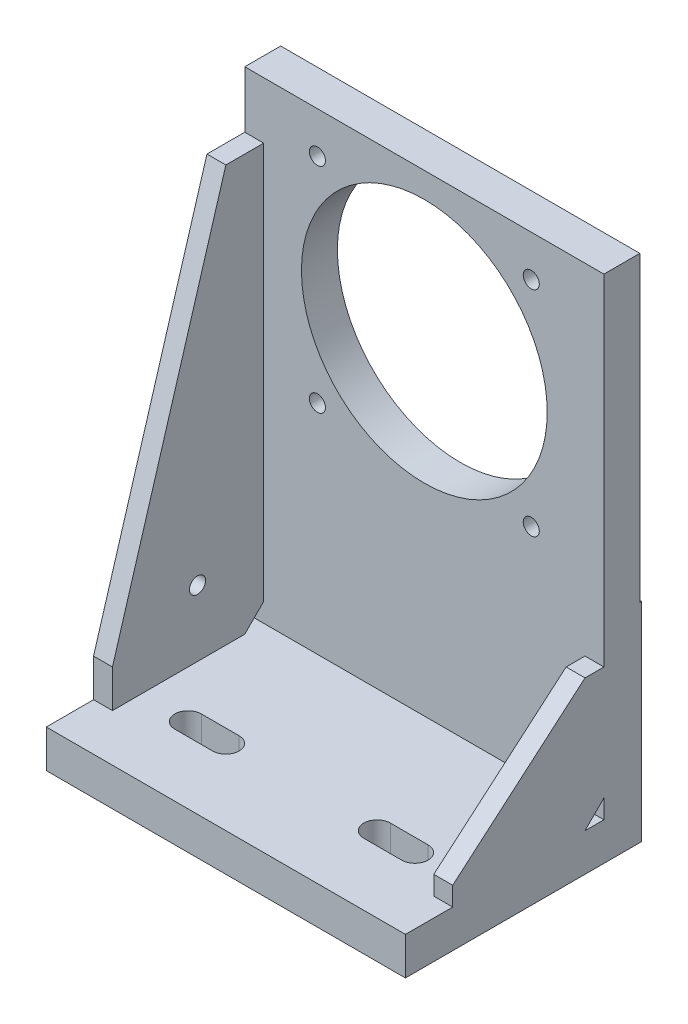
ISO-10303-21;
HEADER;
FILE_DESCRIPTION(('STEP AP214'),'2;1');
FILE_NAME('part.step','',(''),(''),'','','');
FILE_SCHEMA(('AUTOMOTIVE_DESIGN { 1 0 10303 214 1 1 1 1 }'));
ENDSEC;
DATA;
#1=APPLICATION_CONTEXT('core data for automotive mechanical design processes');
#2=APPLICATION_PROTOCOL_DEFINITION('international standard','automotive_design',2000,#1);
#3=PRODUCT_CONTEXT('',#1,'mechanical');
#4=PRODUCT('Part','Part','',(#3));
#5=PRODUCT_RELATED_PRODUCT_CATEGORY('part','',(#4));
#6=PRODUCT_DEFINITION_FORMATION('','',#4);
#7=PRODUCT_DEFINITION_CONTEXT('part definition',#1,'design');
#8=PRODUCT_DEFINITION('design','',#6,#7);
#9=PRODUCT_DEFINITION_SHAPE('','',#8);
#10=(LENGTH_UNIT() NAMED_UNIT(*) SI_UNIT(.MILLI.,.METRE.));
#11=(NAMED_UNIT(*) PLANE_ANGLE_UNIT() SI_UNIT($,.RADIAN.));
#12=(NAMED_UNIT(*) SI_UNIT($,.STERADIAN.) SOLID_ANGLE_UNIT());
#13=UNCERTAINTY_MEASURE_WITH_UNIT(LENGTH_MEASURE(1.E-05),#10,'distance_accuracy_value','');
#14=(GEOMETRIC_REPRESENTATION_CONTEXT(3) GLOBAL_UNCERTAINTY_ASSIGNED_CONTEXT((#13)) GLOBAL_UNIT_ASSIGNED_CONTEXT((#10,
#11,#12)) REPRESENTATION_CONTEXT('',''));
#15=CARTESIAN_POINT('',(0.,0.,0.));
#16=DIRECTION('',(0.,0.,1.));
#17=DIRECTION('',(1.,0.,0.));
#18=AXIS2_PLACEMENT_3D('',#15,#16,#17);
#19=CARTESIAN_POINT('',(0.,20.,0.));
#20=DIRECTION('',(1.,0.,0.));
#21=DIRECTION('',(0.,0.,-1.));
#22=AXIS2_PLACEMENT_3D('',#19,#20,#21);
#23=PLANE('',#22);
#24=DIRECTION('',(0.,1.,0.));
#25=VECTOR('',#24,1.);
#26=CARTESIAN_POINT('',(0.,270.,1.));
#27=LINE('',#26,#25);
#28=CARTESIAN_POINT('',(0.,110.,1.));
#29=VERTEX_POINT('',#28);
#30=CARTESIAN_POINT('',(0.,270.,1.));
#31=VERTEX_POINT('',#30);
#32=EDGE_CURVE('E302',#29,#31,#27,.T.);
#33=ORIENTED_EDGE('',*,*,#32,.F.);
#34=DIRECTION('',(0.,0.,-1.));
#35=VECTOR('',#34,1.);
#36=CARTESIAN_POINT('',(0.,110.,1.));
#37=LINE('',#36,#35);
#38=CARTESIAN_POINT('',(0.,110.,0.));
#39=VERTEX_POINT('',#38);
#40=EDGE_CURVE('E308',#29,#39,#37,.T.);
#41=ORIENTED_EDGE('',*,*,#40,.T.);
#42=DIRECTION('',(0.,-1.,0.));
#43=VECTOR('',#42,1.);
#44=CARTESIAN_POINT('',(0.,20.,0.));
#45=LINE('',#44,#43);
#46=CARTESIAN_POINT('',(0.,0.,0.));
#47=VERTEX_POINT('',#46);
#48=EDGE_CURVE('E428',#39,#47,#45,.T.);
#49=ORIENTED_EDGE('',*,*,#48,.T.);
#50=DIRECTION('',(0.,0.,1.));
#51=VECTOR('',#50,1.);
#52=CARTESIAN_POINT('',(0.,0.,0.));
#53=LINE('',#52,#51);
#54=CARTESIAN_POINT('',(0.,0.,125.));
#55=VERTEX_POINT('',#54);
#56=EDGE_CURVE('E423',#47,#55,#53,.T.);
#57=ORIENTED_EDGE('',*,*,#56,.T.);
#58=DIRECTION('',(0.,-1.,0.));
#59=VECTOR('',#58,1.);
#60=CARTESIAN_POINT('',(0.,20.,125.));
#61=LINE('',#60,#59);
#62=CARTESIAN_POINT('',(0.,20.,125.));
#63=VERTEX_POINT('',#62);
#64=EDGE_CURVE('E41',#63,#55,#61,.T.);
#65=ORIENTED_EDGE('',*,*,#64,.F.);
#66=DIRECTION('',(0.,0.,1.));
#67=VECTOR('',#66,1.);
#68=CARTESIAN_POINT('',(0.,20.,0.));
#69=LINE('',#68,#67);
#70=CARTESIAN_POINT('',(0.,20.,100.));
#71=VERTEX_POINT('',#70);
#72=EDGE_CURVE('E410',#71,#63,#69,.T.);
#73=ORIENTED_EDGE('',*,*,#72,.F.);
#74=DIRECTION('',(0.,1.,0.));
#75=VECTOR('',#74,1.);
#76=CARTESIAN_POINT('',(0.,20.,100.));
#77=LINE('',#76,#75);
#78=CARTESIAN_POINT('',(0.,40.,100.));
#79=VERTEX_POINT('',#78);
#80=EDGE_CURVE('E375',#71,#79,#77,.T.);
#81=ORIENTED_EDGE('',*,*,#80,.T.);
#82=DIRECTION('',(0.,-0.957826285221151,0.287347885566345));
#83=VECTOR('',#82,1.);
#84=CARTESIAN_POINT('',(0.,240.,40.));
#85=LINE('',#84,#83);
#86=CARTESIAN_POINT('',(0.,240.,40.));
#87=VERTEX_POINT('',#86);
#88=EDGE_CURVE('E321',#87,#79,#85,.T.);
#89=ORIENTED_EDGE('',*,*,#88,.F.);
#90=DIRECTION('',(0.,0.,-1.));
#91=VECTOR('',#90,1.);
#92=CARTESIAN_POINT('',(0.,240.,20.));
#93=LINE('',#92,#91);
#94=CARTESIAN_POINT('',(0.,240.,20.));
#95=VERTEX_POINT('',#94);
#96=EDGE_CURVE('E382',#87,#95,#93,.T.);
#97=ORIENTED_EDGE('',*,*,#96,.T.);
#98=DIRECTION('',(0.,1.,0.));
#99=VECTOR('',#98,1.);
#100=CARTESIAN_POINT('',(0.,20.,20.));
#101=LINE('',#100,#99);
#102=CARTESIAN_POINT('',(0.,270.,20.));
#103=VERTEX_POINT('',#102);
#104=EDGE_CURVE('E396',#95,#103,#101,.T.);
#105=ORIENTED_EDGE('',*,*,#104,.T.);
#106=DIRECTION('',(0.,0.,-1.));
#107=VECTOR('',#106,1.);
#108=CARTESIAN_POINT('',(0.,270.,20.));
#109=LINE('',#108,#107);
#110=EDGE_CURVE('E409',#103,#31,#109,.T.);
#111=ORIENTED_EDGE('',*,*,#110,.T.);
#112=EDGE_LOOP('',(#33,#41,#49,#57,#65,#73,#81,#89,#97,#105,#111));
#113=FACE_BOUND('',#112,.T.);
#114=DIRECTION('',(0.,-1.,0.));
#115=VECTOR('',#114,1.);
#116=CARTESIAN_POINT('',(0.,30.,20.));
#117=LINE('',#116,#115);
#118=CARTESIAN_POINT('',(0.,30.,20.));
#119=VERTEX_POINT('',#118);
#120=CARTESIAN_POINT('',(0.,20.,20.));
#121=VERTEX_POINT('',#120);
#122=EDGE_CURVE('E344',#119,#121,#117,.T.);
#123=ORIENTED_EDGE('',*,*,#122,.F.);
#124=DIRECTION('',(0.,0.707106781186548,-0.707106781186548));
#125=VECTOR('',#124,1.);
#126=CARTESIAN_POINT('',(0.,20.,30.));
#127=LINE('',#126,#125);
#128=CARTESIAN_POINT('',(0.,20.,30.));
#129=VERTEX_POINT('',#128);
#130=EDGE_CURVE('E331',#129,#119,#127,.T.);
#131=ORIENTED_EDGE('',*,*,#130,.F.);
#132=DIRECTION('',(0.,0.,1.));
#133=VECTOR('',#132,1.);
#134=CARTESIAN_POINT('',(0.,20.,20.));
#135=LINE('',#134,#133);
#136=EDGE_CURVE('E336',#121,#129,#135,.T.);
#137=ORIENTED_EDGE('',*,*,#136,.F.);
#138=EDGE_LOOP('',(#123,#131,#137));
#139=FACE_BOUND('',#138,.T.);
#140=CARTESIAN_POINT('',(0.,55.,55.));
#141=DIRECTION('',(-1.,0.,0.));
#142=DIRECTION('',(0.,0.,1.));
#143=AXIS2_PLACEMENT_3D('',#140,#141,#142);
#144=CIRCLE('',#143,4.24999999999999);
#145=CARTESIAN_POINT('',(0.,55.,59.25));
#146=VERTEX_POINT('',#145);
#147=EDGE_CURVE('E902',#146,#146,#144,.T.);
#148=ORIENTED_EDGE('',*,*,#147,.F.);
#149=EDGE_LOOP('',(#148));
#150=FACE_BOUND('',#149,.T.);
#151=ADVANCED_FACE('F34',(#113,#139,#150),#23,.F.);
#152=CARTESIAN_POINT('',(0.,270.,20.));
#153=DIRECTION('',(0.,1.,0.));
#154=DIRECTION('',(-1.,0.,0.));
#155=AXIS2_PLACEMENT_3D('',#152,#153,#154);
#156=PLANE('',#155);
#157=DIRECTION('',(0.,0.,-1.));
#158=VECTOR('',#157,1.);
#159=CARTESIAN_POINT('',(190.,270.,20.));
#160=LINE('',#159,#158);
#161=CARTESIAN_POINT('',(190.,270.,20.));
#162=VERTEX_POINT('',#161);
#163=CARTESIAN_POINT('',(190.,270.,1.));
#164=VERTEX_POINT('',#163);
#165=EDGE_CURVE('E405',#162,#164,#160,.T.);
#166=ORIENTED_EDGE('',*,*,#165,.T.);
#167=DIRECTION('',(1.,0.,0.));
#168=VECTOR('',#167,1.);
#169=CARTESIAN_POINT('',(190.,270.,1.));
#170=LINE('',#169,#168);
#171=EDGE_CURVE('E304',#31,#164,#170,.T.);
#172=ORIENTED_EDGE('',*,*,#171,.F.);
#173=ORIENTED_EDGE('',*,*,#110,.F.);
#174=DIRECTION('',(1.,0.,0.));
#175=VECTOR('',#174,1.);
#176=CARTESIAN_POINT('',(0.,270.,20.));
#177=LINE('',#176,#175);
#178=EDGE_CURVE('E399',#103,#162,#177,.T.);
#179=ORIENTED_EDGE('',*,*,#178,.T.);
#180=EDGE_LOOP('',(#166,#172,#173,#179));
#181=FACE_BOUND('',#180,.T.);
#182=ADVANCED_FACE('F448',(#181),#156,.T.);
#183=CARTESIAN_POINT('',(0.,20.,125.));
#184=DIRECTION('',(0.,1.,0.));
#185=DIRECTION('',(0.,0.,1.));
#186=AXIS2_PLACEMENT_3D('',#183,#184,#185);
#187=PLANE('',#186);
#188=CARTESIAN_POINT('',(135.,20.,85.));
#189=DIRECTION('',(0.,1.,0.));
#190=DIRECTION('',(0.,0.,1.));
#191=AXIS2_PLACEMENT_3D('',#188,#189,#190);
#192=CIRCLE('',#191,6.99999999999999);
#193=CARTESIAN_POINT('',(135.,20.,78.));
#194=VERTEX_POINT('',#193);
#195=CARTESIAN_POINT('',(135.,20.,92.));
#196=VERTEX_POINT('',#195);
#197=EDGE_CURVE('E48',#194,#196,#192,.T.);
#198=ORIENTED_EDGE('',*,*,#197,.F.);
#199=DIRECTION('',(-1.,0.,0.));
#200=VECTOR('',#199,1.);
#201=CARTESIAN_POINT('',(135.,20.,78.));
#202=LINE('',#201,#200);
#203=CARTESIAN_POINT('',(155.,20.,78.));
#204=VERTEX_POINT('',#203);
#205=EDGE_CURVE('E236',#204,#194,#202,.T.);
#206=ORIENTED_EDGE('',*,*,#205,.F.);
#207=CARTESIAN_POINT('',(155.,20.,85.));
#208=DIRECTION('',(0.,1.,0.));
#209=DIRECTION('',(0.,0.,1.));
#210=AXIS2_PLACEMENT_3D('',#207,#208,#209);
#211=CIRCLE('',#210,6.99999999999999);
#212=CARTESIAN_POINT('',(155.,20.,92.));
#213=VERTEX_POINT('',#212);
#214=EDGE_CURVE('E239',#213,#204,#211,.T.);
#215=ORIENTED_EDGE('',*,*,#214,.F.);
#216=DIRECTION('',(1.,0.,0.));
#217=VECTOR('',#216,1.);
#218=CARTESIAN_POINT('',(135.,20.,92.));
#219=LINE('',#218,#217);
#220=EDGE_CURVE('E248',#196,#213,#219,.T.);
#221=ORIENTED_EDGE('',*,*,#220,.F.);
#222=EDGE_LOOP('',(#198,#206,#215,#221));
#223=FACE_BOUND('',#222,.T.);
#224=CARTESIAN_POINT('',(35.,20.,85.));
#225=DIRECTION('',(0.,1.,0.));
#226=DIRECTION('',(0.,0.,1.));
#227=AXIS2_PLACEMENT_3D('',#224,#225,#226);
#228=CIRCLE('',#227,7.00000000000001);
#229=CARTESIAN_POINT('',(35.,20.,78.));
#230=VERTEX_POINT('',#229);
#231=CARTESIAN_POINT('',(35.,20.,92.));
#232=VERTEX_POINT('',#231);
#233=EDGE_CURVE('E254',#230,#232,#228,.T.);
#234=ORIENTED_EDGE('',*,*,#233,.F.);
#235=DIRECTION('',(-1.,0.,0.));
#236=VECTOR('',#235,1.);
#237=CARTESIAN_POINT('',(35.,20.,78.));
#238=LINE('',#237,#236);
#239=CARTESIAN_POINT('',(55.,20.,78.));
#240=VERTEX_POINT('',#239);
#241=EDGE_CURVE('E262',#240,#230,#238,.T.);
#242=ORIENTED_EDGE('',*,*,#241,.F.);
#243=CARTESIAN_POINT('',(55.,20.,85.));
#244=DIRECTION('',(0.,1.,0.));
#245=DIRECTION('',(0.,0.,1.));
#246=AXIS2_PLACEMENT_3D('',#243,#244,#245);
#247=CIRCLE('',#246,7.00000000000001);
#248=CARTESIAN_POINT('',(55.,20.,92.));
#249=VERTEX_POINT('',#248);
#250=EDGE_CURVE('E276',#249,#240,#247,.T.);
#251=ORIENTED_EDGE('',*,*,#250,.F.);
#252=DIRECTION('',(1.,0.,0.));
#253=VECTOR('',#252,1.);
#254=CARTESIAN_POINT('',(35.,20.,92.));
#255=LINE('',#254,#253);
#256=EDGE_CURVE('E273',#232,#249,#255,.T.);
#257=ORIENTED_EDGE('',*,*,#256,.F.);
#258=EDGE_LOOP('',(#234,#242,#251,#257));
#259=FACE_BOUND('',#258,.T.);
#260=DIRECTION('',(0.,0.,-1.));
#261=VECTOR('',#260,1.);
#262=CARTESIAN_POINT('',(180.,20.,20.));
#263=LINE('',#262,#261);
#264=CARTESIAN_POINT('',(180.,20.,100.));
#265=VERTEX_POINT('',#264);
#266=CARTESIAN_POINT('',(180.,20.,30.));
#267=VERTEX_POINT('',#266);
#268=EDGE_CURVE('E365',#265,#267,#263,.T.);
#269=ORIENTED_EDGE('',*,*,#268,.T.);
#270=DIRECTION('',(-1.,0.,0.));
#271=VECTOR('',#270,1.);
#272=CARTESIAN_POINT('',(190.,20.,30.));
#273=LINE('',#272,#271);
#274=CARTESIAN_POINT('',(190.,20.,30.));
#275=VERTEX_POINT('',#274);
#276=EDGE_CURVE('E349',#275,#267,#273,.T.);
#277=ORIENTED_EDGE('',*,*,#276,.F.);
#278=DIRECTION('',(0.,0.,1.));
#279=VECTOR('',#278,1.);
#280=CARTESIAN_POINT('',(190.,20.,20.));
#281=LINE('',#280,#279);
#282=CARTESIAN_POINT('',(190.,20.,20.));
#283=VERTEX_POINT('',#282);
#284=EDGE_CURVE('E339',#283,#275,#281,.T.);
#285=ORIENTED_EDGE('',*,*,#284,.F.);
#286=DIRECTION('',(-1.,0.,0.));
#287=VECTOR('',#286,1.);
#288=CARTESIAN_POINT('',(0.,20.,20.));
#289=LINE('',#288,#287);
#290=EDGE_CURVE('E407',#283,#121,#289,.T.);
#291=ORIENTED_EDGE('',*,*,#290,.T.);
#292=ORIENTED_EDGE('',*,*,#136,.T.);
#293=CARTESIAN_POINT('',(10.,20.,30.));
#294=VERTEX_POINT('',#293);
#295=EDGE_CURVE('E352',#294,#129,#273,.T.);
#296=ORIENTED_EDGE('',*,*,#295,.F.);
#297=DIRECTION('',(0.,0.,1.));
#298=VECTOR('',#297,1.);
#299=CARTESIAN_POINT('',(10.,20.,20.));
#300=LINE('',#299,#298);
#301=CARTESIAN_POINT('',(10.,20.,100.));
#302=VERTEX_POINT('',#301);
#303=EDGE_CURVE('E381',#294,#302,#300,.T.);
#304=ORIENTED_EDGE('',*,*,#303,.T.);
#305=DIRECTION('',(-1.,0.,0.));
#306=VECTOR('',#305,1.);
#307=CARTESIAN_POINT('',(10.,20.,100.));
#308=LINE('',#307,#306);
#309=EDGE_CURVE('E389',#302,#71,#308,.T.);
#310=ORIENTED_EDGE('',*,*,#309,.T.);
#311=ORIENTED_EDGE('',*,*,#72,.T.);
#312=DIRECTION('',(1.,0.,0.));
#313=VECTOR('',#312,1.);
#314=CARTESIAN_POINT('',(0.,20.,125.));
#315=LINE('',#314,#313);
#316=CARTESIAN_POINT('',(190.,20.,125.));
#317=VERTEX_POINT('',#316);
#318=EDGE_CURVE('E413',#63,#317,#315,.T.);
#319=ORIENTED_EDGE('',*,*,#318,.T.);
#320=DIRECTION('',(0.,0.,-1.));
#321=VECTOR('',#320,1.);
#322=CARTESIAN_POINT('',(190.,20.,0.));
#323=LINE('',#322,#321);
#324=CARTESIAN_POINT('',(190.,20.,100.));
#325=VERTEX_POINT('',#324);
#326=EDGE_CURVE('E420',#317,#325,#323,.T.);
#327=ORIENTED_EDGE('',*,*,#326,.T.);
#328=DIRECTION('',(1.,0.,0.));
#329=VECTOR('',#328,1.);
#330=CARTESIAN_POINT('',(180.,20.,100.));
#331=LINE('',#330,#329);
#332=EDGE_CURVE('E372',#265,#325,#331,.T.);
#333=ORIENTED_EDGE('',*,*,#332,.F.);
#334=EDGE_LOOP('',(#269,#277,#285,#291,#292,#296,#304,#310,#311,#319,#327,#333));
#335=FACE_BOUND('',#334,.T.);
#336=ADVANCED_FACE('F478',(#223,#259,#335),#187,.T.);
#337=CARTESIAN_POINT('',(0.,20.,125.));
#338=DIRECTION('',(0.,0.,-1.));
#339=DIRECTION('',(-1.,0.,0.));
#340=AXIS2_PLACEMENT_3D('',#337,#338,#339);
#341=PLANE('',#340);
#342=DIRECTION('',(1.,0.,0.));
#343=VECTOR('',#342,1.);
#344=CARTESIAN_POINT('',(0.,0.,125.));
#345=LINE('',#344,#343);
#346=CARTESIAN_POINT('',(190.,0.,125.));
#347=VERTEX_POINT('',#346);
#348=EDGE_CURVE('E454',#55,#347,#345,.T.);
#349=ORIENTED_EDGE('',*,*,#348,.T.);
#350=DIRECTION('',(0.,-1.,0.));
#351=VECTOR('',#350,1.);
#352=CARTESIAN_POINT('',(190.,20.,125.));
#353=LINE('',#352,#351);
#354=EDGE_CURVE('E469',#317,#347,#353,.T.);
#355=ORIENTED_EDGE('',*,*,#354,.F.);
#356=ORIENTED_EDGE('',*,*,#318,.F.);
#357=ORIENTED_EDGE('',*,*,#64,.T.);
#358=EDGE_LOOP('',(#349,#355,#356,#357));
#359=FACE_BOUND('',#358,.T.);
#360=ADVANCED_FACE('F473',(#359),#341,.F.);
#361=CARTESIAN_POINT('',(190.,20.,0.));
#362=DIRECTION('',(-1.,0.,0.));
#363=DIRECTION('',(0.,0.,1.));
#364=AXIS2_PLACEMENT_3D('',#361,#362,#363);
#365=PLANE('',#364);
#366=ORIENTED_EDGE('',*,*,#284,.T.);
#367=DIRECTION('',(0.,0.707106781186548,-0.707106781186548));
#368=VECTOR('',#367,1.);
#369=CARTESIAN_POINT('',(190.,20.,30.));
#370=LINE('',#369,#368);
#371=CARTESIAN_POINT('',(190.,30.,20.));
#372=VERTEX_POINT('',#371);
#373=EDGE_CURVE('E332',#275,#372,#370,.T.);
#374=ORIENTED_EDGE('',*,*,#373,.T.);
#375=DIRECTION('',(0.,-1.,0.));
#376=VECTOR('',#375,1.);
#377=CARTESIAN_POINT('',(190.,30.,20.));
#378=LINE('',#377,#376);
#379=EDGE_CURVE('E335',#372,#283,#378,.T.);
#380=ORIENTED_EDGE('',*,*,#379,.T.);
#381=EDGE_LOOP('',(#366,#374,#380));
#382=FACE_BOUND('',#381,.T.);
#383=DIRECTION('',(0.,-1.,0.));
#384=VECTOR('',#383,1.);
#385=CARTESIAN_POINT('',(190.,20.,0.));
#386=LINE('',#385,#384);
#387=CARTESIAN_POINT('',(190.,110.,0.));
#388=VERTEX_POINT('',#387);
#389=CARTESIAN_POINT('',(190.,0.,0.));
#390=VERTEX_POINT('',#389);
#391=EDGE_CURVE('E468',#388,#390,#386,.T.);
#392=ORIENTED_EDGE('',*,*,#391,.F.);
#393=DIRECTION('',(0.,0.,-1.));
#394=VECTOR('',#393,1.);
#395=CARTESIAN_POINT('',(190.,110.,1.));
#396=LINE('',#395,#394);
#397=CARTESIAN_POINT('',(190.,110.,1.));
#398=VERTEX_POINT('',#397);
#399=EDGE_CURVE('E306',#398,#388,#396,.T.);
#400=ORIENTED_EDGE('',*,*,#399,.F.);
#401=DIRECTION('',(0.,-1.,0.));
#402=VECTOR('',#401,1.);
#403=CARTESIAN_POINT('',(190.,270.,1.));
#404=LINE('',#403,#402);
#405=EDGE_CURVE('E296',#164,#398,#404,.T.);
#406=ORIENTED_EDGE('',*,*,#405,.F.);
#407=ORIENTED_EDGE('',*,*,#165,.F.);
#408=DIRECTION('',(0.,-1.,0.));
#409=VECTOR('',#408,1.);
#410=CARTESIAN_POINT('',(190.,20.,20.));
#411=LINE('',#410,#409);
#412=CARTESIAN_POINT('',(190.,90.,20.));
#413=VERTEX_POINT('',#412);
#414=EDGE_CURVE('E402',#162,#413,#411,.T.);
#415=ORIENTED_EDGE('',*,*,#414,.T.);
#416=DIRECTION('',(0.,0.,1.));
#417=VECTOR('',#416,1.);
#418=CARTESIAN_POINT('',(190.,90.,20.));
#419=LINE('',#418,#417);
#420=CARTESIAN_POINT('',(190.,90.,30.));
#421=VERTEX_POINT('',#420);
#422=EDGE_CURVE('E356',#413,#421,#419,.T.);
#423=ORIENTED_EDGE('',*,*,#422,.T.);
#424=DIRECTION('',(0.,0.650791373455969,-0.759256602365297));
#425=VECTOR('',#424,1.);
#426=CARTESIAN_POINT('',(190.,90.,30.));
#427=LINE('',#426,#425);
#428=CARTESIAN_POINT('',(190.,30.,100.));
#429=VERTEX_POINT('',#428);
#430=EDGE_CURVE('E311',#429,#421,#427,.T.);
#431=ORIENTED_EDGE('',*,*,#430,.F.);
#432=DIRECTION('',(0.,-1.,0.));
#433=VECTOR('',#432,1.);
#434=CARTESIAN_POINT('',(190.,20.,100.));
#435=LINE('',#434,#433);
#436=EDGE_CURVE('E360',#429,#325,#435,.T.);
#437=ORIENTED_EDGE('',*,*,#436,.T.);
#438=ORIENTED_EDGE('',*,*,#326,.F.);
#439=ORIENTED_EDGE('',*,*,#354,.T.);
#440=DIRECTION('',(0.,0.,-1.));
#441=VECTOR('',#440,1.);
#442=CARTESIAN_POINT('',(190.,0.,0.));
#443=LINE('',#442,#441);
#444=EDGE_CURVE('E457',#347,#390,#443,.T.);
#445=ORIENTED_EDGE('',*,*,#444,.T.);
#446=EDGE_LOOP('',(#392,#400,#406,#407,#415,#423,#431,#437,#438,#439,#445));
#447=FACE_BOUND('',#446,.T.);
#448=ADVANCED_FACE('F437',(#382,#447),#365,.F.);
#449=CARTESIAN_POINT('',(0.,20.,0.));
#450=DIRECTION('',(0.,0.,1.));
#451=DIRECTION('',(1.,0.,0.));
#452=AXIS2_PLACEMENT_3D('',#449,#450,#451);
#453=PLANE('',#452);
#454=ORIENTED_EDGE('',*,*,#48,.F.);
#455=DIRECTION('',(-1.,0.,0.));
#456=VECTOR('',#455,1.);
#457=CARTESIAN_POINT('',(190.,110.,0.));
#458=LINE('',#457,#456);
#459=EDGE_CURVE('E295',#388,#39,#458,.T.);
#460=ORIENTED_EDGE('',*,*,#459,.F.);
#461=ORIENTED_EDGE('',*,*,#391,.T.);
#462=DIRECTION('',(-1.,0.,0.));
#463=VECTOR('',#462,1.);
#464=CARTESIAN_POINT('',(0.,0.,0.));
#465=LINE('',#464,#463);
#466=EDGE_CURVE('E414',#390,#47,#465,.T.);
#467=ORIENTED_EDGE('',*,*,#466,.T.);
#468=EDGE_LOOP('',(#454,#460,#461,#467));
#469=FACE_BOUND('',#468,.T.);
#470=ADVANCED_FACE('F552',(#469),#453,.F.);
#471=CARTESIAN_POINT('',(0.,0.,125.));
#472=DIRECTION('',(0.,1.,0.));
#473=DIRECTION('',(0.,0.,1.));
#474=AXIS2_PLACEMENT_3D('',#471,#472,#473);
#475=PLANE('',#474);
#476=DIRECTION('',(-1.,0.,0.));
#477=VECTOR('',#476,1.);
#478=CARTESIAN_POINT('',(135.,0.,78.));
#479=LINE('',#478,#477);
#480=CARTESIAN_POINT('',(155.,0.,78.));
#481=VERTEX_POINT('',#480);
#482=CARTESIAN_POINT('',(135.,0.,78.));
#483=VERTEX_POINT('',#482);
#484=EDGE_CURVE('E226',#481,#483,#479,.T.);
#485=ORIENTED_EDGE('',*,*,#484,.T.);
#486=CARTESIAN_POINT('',(135.,0.,85.));
#487=DIRECTION('',(0.,1.,0.));
#488=DIRECTION('',(0.,0.,1.));
#489=AXIS2_PLACEMENT_3D('',#486,#487,#488);
#490=CIRCLE('',#489,6.99999999999999);
#491=CARTESIAN_POINT('',(135.,0.,92.));
#492=VERTEX_POINT('',#491);
#493=EDGE_CURVE('E220',#483,#492,#490,.T.);
#494=ORIENTED_EDGE('',*,*,#493,.T.);
#495=DIRECTION('',(1.,0.,0.));
#496=VECTOR('',#495,1.);
#497=CARTESIAN_POINT('',(135.,0.,92.));
#498=LINE('',#497,#496);
#499=CARTESIAN_POINT('',(155.,0.,92.));
#500=VERTEX_POINT('',#499);
#501=EDGE_CURVE('E229',#492,#500,#498,.T.);
#502=ORIENTED_EDGE('',*,*,#501,.T.);
#503=CARTESIAN_POINT('',(155.,0.,85.));
#504=DIRECTION('',(0.,1.,0.));
#505=DIRECTION('',(0.,0.,1.));
#506=AXIS2_PLACEMENT_3D('',#503,#504,#505);
#507=CIRCLE('',#506,6.99999999999999);
#508=EDGE_CURVE('E56',#500,#481,#507,.T.);
#509=ORIENTED_EDGE('',*,*,#508,.T.);
#510=EDGE_LOOP('',(#485,#494,#502,#509));
#511=FACE_BOUND('',#510,.T.);
#512=DIRECTION('',(-1.,0.,0.));
#513=VECTOR('',#512,1.);
#514=CARTESIAN_POINT('',(35.,0.,78.));
#515=LINE('',#514,#513);
#516=CARTESIAN_POINT('',(55.,0.,78.));
#517=VERTEX_POINT('',#516);
#518=CARTESIAN_POINT('',(35.,0.,78.));
#519=VERTEX_POINT('',#518);
#520=EDGE_CURVE('E268',#517,#519,#515,.T.);
#521=ORIENTED_EDGE('',*,*,#520,.T.);
#522=CARTESIAN_POINT('',(35.,0.,85.));
#523=DIRECTION('',(0.,1.,0.));
#524=DIRECTION('',(0.,0.,1.));
#525=AXIS2_PLACEMENT_3D('',#522,#523,#524);
#526=CIRCLE('',#525,7.00000000000001);
#527=CARTESIAN_POINT('',(35.,0.,92.));
#528=VERTEX_POINT('',#527);
#529=EDGE_CURVE('E258',#519,#528,#526,.T.);
#530=ORIENTED_EDGE('',*,*,#529,.T.);
#531=DIRECTION('',(1.,0.,0.));
#532=VECTOR('',#531,1.);
#533=CARTESIAN_POINT('',(35.,0.,92.));
#534=LINE('',#533,#532);
#535=CARTESIAN_POINT('',(55.,0.,92.));
#536=VERTEX_POINT('',#535);
#537=EDGE_CURVE('E261',#528,#536,#534,.T.);
#538=ORIENTED_EDGE('',*,*,#537,.T.);
#539=CARTESIAN_POINT('',(55.,0.,85.));
#540=DIRECTION('',(0.,1.,0.));
#541=DIRECTION('',(0.,0.,1.));
#542=AXIS2_PLACEMENT_3D('',#539,#540,#541);
#543=CIRCLE('',#542,7.00000000000001);
#544=EDGE_CURVE('E265',#536,#517,#543,.T.);
#545=ORIENTED_EDGE('',*,*,#544,.T.);
#546=EDGE_LOOP('',(#521,#530,#538,#545));
#547=FACE_BOUND('',#546,.T.);
#548=ORIENTED_EDGE('',*,*,#56,.F.);
#549=ORIENTED_EDGE('',*,*,#466,.F.);
#550=ORIENTED_EDGE('',*,*,#444,.F.);
#551=ORIENTED_EDGE('',*,*,#348,.F.);
#552=EDGE_LOOP('',(#548,#549,#550,#551));
#553=FACE_BOUND('',#552,.T.);
#554=ADVANCED_FACE('F233',(#511,#547,#553),#475,.F.);
#555=CARTESIAN_POINT('',(0.,270.,20.));
#556=DIRECTION('',(0.,0.,-1.));
#557=DIRECTION('',(-1.,0.,0.));
#558=AXIS2_PLACEMENT_3D('',#555,#556,#557);
#559=PLANE('',#558);
#560=CARTESIAN_POINT('',(38.4314575050759,248.268542494923,20.));
#561=DIRECTION('',(0.,0.,-1.));
#562=DIRECTION('',(-1.,0.,0.));
#563=AXIS2_PLACEMENT_3D('',#560,#561,#562);
#564=CIRCLE('',#563,4.24999999999998);
#565=CARTESIAN_POINT('',(34.1814575050759,248.268542494923,20.));
#566=VERTEX_POINT('',#565);
#567=EDGE_CURVE('E895',#566,#566,#564,.T.);
#568=ORIENTED_EDGE('',*,*,#567,.T.);
#569=EDGE_LOOP('',(#568));
#570=FACE_BOUND('',#569,.T.);
#571=CARTESIAN_POINT('',(151.568542494924,248.268542494924,20.));
#572=DIRECTION('',(0.,0.,-1.));
#573=DIRECTION('',(-1.,0.,0.));
#574=AXIS2_PLACEMENT_3D('',#571,#572,#573);
#575=CIRCLE('',#574,4.24999999999998);
#576=CARTESIAN_POINT('',(147.318542494924,248.268542494924,20.));
#577=VERTEX_POINT('',#576);
#578=EDGE_CURVE('E891',#577,#577,#575,.T.);
#579=ORIENTED_EDGE('',*,*,#578,.T.);
#580=EDGE_LOOP('',(#579));
#581=FACE_BOUND('',#580,.T.);
#582=CARTESIAN_POINT('',(151.568542494924,135.131457505076,20.));
#583=DIRECTION('',(0.,0.,-1.));
#584=DIRECTION('',(-1.,0.,0.));
#585=AXIS2_PLACEMENT_3D('',#582,#583,#584);
#586=CIRCLE('',#585,4.24999999999998);
#587=CARTESIAN_POINT('',(147.318542494924,135.131457505076,20.));
#588=VERTEX_POINT('',#587);
#589=EDGE_CURVE('E885',#588,#588,#586,.T.);
#590=ORIENTED_EDGE('',*,*,#589,.T.);
#591=EDGE_LOOP('',(#590));
#592=FACE_BOUND('',#591,.T.);
#593=CARTESIAN_POINT('',(38.4314575050759,135.131457505076,20.));
#594=DIRECTION('',(0.,0.,-1.));
#595=DIRECTION('',(-1.,0.,0.));
#596=AXIS2_PLACEMENT_3D('',#593,#594,#595);
#597=CIRCLE('',#596,4.24999999999998);
#598=CARTESIAN_POINT('',(34.1814575050759,135.131457505076,20.));
#599=VERTEX_POINT('',#598);
#600=EDGE_CURVE('E242',#599,#599,#597,.T.);
#601=ORIENTED_EDGE('',*,*,#600,.T.);
#602=EDGE_LOOP('',(#601));
#603=FACE_BOUND('',#602,.T.);
#604=CARTESIAN_POINT('',(95.,191.7,20.));
#605=DIRECTION('',(0.,0.,-1.));
#606=DIRECTION('',(-1.,0.,0.));
#607=AXIS2_PLACEMENT_3D('',#604,#605,#606);
#608=CIRCLE('',#607,65.);
#609=CARTESIAN_POINT('',(30.,191.7,20.));
#610=VERTEX_POINT('',#609);
#611=EDGE_CURVE('E292',#610,#610,#608,.T.);
#612=ORIENTED_EDGE('',*,*,#611,.T.);
#613=EDGE_LOOP('',(#612));
#614=FACE_BOUND('',#613,.T.);
#615=DIRECTION('',(0.,-1.,0.));
#616=VECTOR('',#615,1.);
#617=CARTESIAN_POINT('',(10.,20.,20.));
#618=LINE('',#617,#616);
#619=CARTESIAN_POINT('',(10.,240.,20.));
#620=VERTEX_POINT('',#619);
#621=CARTESIAN_POINT('',(10.,30.,20.));
#622=VERTEX_POINT('',#621);
#623=EDGE_CURVE('E378',#620,#622,#618,.T.);
#624=ORIENTED_EDGE('',*,*,#623,.T.);
#625=DIRECTION('',(-1.,0.,0.));
#626=VECTOR('',#625,1.);
#627=CARTESIAN_POINT('',(190.,30.,20.));
#628=LINE('',#627,#626);
#629=EDGE_CURVE('E342',#622,#119,#628,.T.);
#630=ORIENTED_EDGE('',*,*,#629,.T.);
#631=ORIENTED_EDGE('',*,*,#122,.T.);
#632=ORIENTED_EDGE('',*,*,#290,.F.);
#633=ORIENTED_EDGE('',*,*,#379,.F.);
#634=CARTESIAN_POINT('',(180.,30.,20.));
#635=VERTEX_POINT('',#634);
#636=EDGE_CURVE('E353',#372,#635,#628,.T.);
#637=ORIENTED_EDGE('',*,*,#636,.T.);
#638=DIRECTION('',(0.,1.,0.));
#639=VECTOR('',#638,1.);
#640=CARTESIAN_POINT('',(180.,20.,20.));
#641=LINE('',#640,#639);
#642=CARTESIAN_POINT('',(180.,90.,20.));
#643=VERTEX_POINT('',#642);
#644=EDGE_CURVE('E357',#635,#643,#641,.T.);
#645=ORIENTED_EDGE('',*,*,#644,.T.);
#646=DIRECTION('',(1.,0.,0.));
#647=VECTOR('',#646,1.);
#648=CARTESIAN_POINT('',(180.,90.,20.));
#649=LINE('',#648,#647);
#650=EDGE_CURVE('E368',#643,#413,#649,.T.);
#651=ORIENTED_EDGE('',*,*,#650,.T.);
#652=ORIENTED_EDGE('',*,*,#414,.F.);
#653=ORIENTED_EDGE('',*,*,#178,.F.);
#654=ORIENTED_EDGE('',*,*,#104,.F.);
#655=DIRECTION('',(-1.,0.,0.));
#656=VECTOR('',#655,1.);
#657=CARTESIAN_POINT('',(10.,240.,20.));
#658=LINE('',#657,#656);
#659=EDGE_CURVE('E393',#620,#95,#658,.T.);
#660=ORIENTED_EDGE('',*,*,#659,.F.);
#661=EDGE_LOOP('',(#624,#630,#631,#632,#633,#637,#645,#651,#652,#653,#654,#660));
#662=FACE_BOUND('',#661,.T.);
#663=ADVANCED_FACE('F443',(#570,#581,#592,#603,#614,#662),#559,.F.);
#664=CARTESIAN_POINT('',(10.,240.,20.));
#665=DIRECTION('',(0.,1.,0.));
#666=DIRECTION('',(0.,0.,1.));
#667=AXIS2_PLACEMENT_3D('',#664,#665,#666);
#668=PLANE('',#667);
#669=DIRECTION('',(-1.,0.,0.));
#670=VECTOR('',#669,1.);
#671=CARTESIAN_POINT('',(218.806130178211,240.,40.));
#672=LINE('',#671,#670);
#673=CARTESIAN_POINT('',(10.,240.,40.));
#674=VERTEX_POINT('',#673);
#675=EDGE_CURVE('E329',#674,#87,#672,.T.);
#676=ORIENTED_EDGE('',*,*,#675,.F.);
#677=DIRECTION('',(0.,0.,-1.));
#678=VECTOR('',#677,1.);
#679=CARTESIAN_POINT('',(10.,240.,20.));
#680=LINE('',#679,#678);
#681=EDGE_CURVE('E387',#674,#620,#680,.T.);
#682=ORIENTED_EDGE('',*,*,#681,.T.);
#683=ORIENTED_EDGE('',*,*,#659,.T.);
#684=ORIENTED_EDGE('',*,*,#96,.F.);
#685=EDGE_LOOP('',(#676,#682,#683,#684));
#686=FACE_BOUND('',#685,.T.);
#687=ADVANCED_FACE('F495',(#686),#668,.T.);
#688=CARTESIAN_POINT('',(10.,20.,100.));
#689=DIRECTION('',(0.,0.,1.));
#690=DIRECTION('',(1.,0.,0.));
#691=AXIS2_PLACEMENT_3D('',#688,#689,#690);
#692=PLANE('',#691);
#693=DIRECTION('',(-1.,0.,0.));
#694=VECTOR('',#693,1.);
#695=CARTESIAN_POINT('',(218.806130178211,40.,100.));
#696=LINE('',#695,#694);
#697=CARTESIAN_POINT('',(10.,40.,100.));
#698=VERTEX_POINT('',#697);
#699=EDGE_CURVE('E326',#698,#79,#696,.T.);
#700=ORIENTED_EDGE('',*,*,#699,.T.);
#701=ORIENTED_EDGE('',*,*,#80,.F.);
#702=ORIENTED_EDGE('',*,*,#309,.F.);
#703=DIRECTION('',(0.,1.,0.));
#704=VECTOR('',#703,1.);
#705=CARTESIAN_POINT('',(10.,20.,100.));
#706=LINE('',#705,#704);
#707=EDGE_CURVE('E384',#302,#698,#706,.T.);
#708=ORIENTED_EDGE('',*,*,#707,.T.);
#709=EDGE_LOOP('',(#700,#701,#702,#708));
#710=FACE_BOUND('',#709,.T.);
#711=ADVANCED_FACE('F484',(#710),#692,.T.);
#712=CARTESIAN_POINT('',(10.,240.,20.));
#713=DIRECTION('',(1.,0.,0.));
#714=DIRECTION('',(0.,0.,-1.));
#715=AXIS2_PLACEMENT_3D('',#712,#713,#714);
#716=PLANE('',#715);
#717=CARTESIAN_POINT('',(10.,55.,55.));
#718=DIRECTION('',(1.,0.,0.));
#719=DIRECTION('',(0.,0.,-1.));
#720=AXIS2_PLACEMENT_3D('',#717,#718,#719);
#721=CIRCLE('',#720,4.24999999999999);
#722=CARTESIAN_POINT('',(10.,55.,50.75));
#723=VERTEX_POINT('',#722);
#724=EDGE_CURVE('E899',#723,#723,#721,.T.);
#725=ORIENTED_EDGE('',*,*,#724,.F.);
#726=EDGE_LOOP('',(#725));
#727=FACE_BOUND('',#726,.T.);
#728=DIRECTION('',(0.,-0.957826285221152,0.287347885566345));
#729=VECTOR('',#728,1.);
#730=CARTESIAN_POINT('',(10.,240.,40.));
#731=LINE('',#730,#729);
#732=EDGE_CURVE('E323',#674,#698,#731,.T.);
#733=ORIENTED_EDGE('',*,*,#732,.T.);
#734=ORIENTED_EDGE('',*,*,#707,.F.);
#735=ORIENTED_EDGE('',*,*,#303,.F.);
#736=DIRECTION('',(0.,-0.707106781186548,0.707106781186548));
#737=VECTOR('',#736,1.);
#738=CARTESIAN_POINT('',(9.99999999999999,135.,-85.));
#739=LINE('',#738,#737);
#740=EDGE_CURVE('E351',#622,#294,#739,.T.);
#741=ORIENTED_EDGE('',*,*,#740,.F.);
#742=ORIENTED_EDGE('',*,*,#623,.F.);
#743=ORIENTED_EDGE('',*,*,#681,.F.);
#744=EDGE_LOOP('',(#733,#734,#735,#741,#742,#743));
#745=FACE_BOUND('',#744,.T.);
#746=ADVANCED_FACE('F486',(#727,#745),#716,.T.);
#747=CARTESIAN_POINT('',(180.,20.,100.));
#748=DIRECTION('',(0.,0.,1.));
#749=DIRECTION('',(1.,0.,0.));
#750=AXIS2_PLACEMENT_3D('',#747,#748,#749);
#751=PLANE('',#750);
#752=DIRECTION('',(1.,0.,0.));
#753=VECTOR('',#752,1.);
#754=CARTESIAN_POINT('',(87.8045554270712,30.,100.));
#755=LINE('',#754,#753);
#756=CARTESIAN_POINT('',(180.,30.,100.));
#757=VERTEX_POINT('',#756);
#758=EDGE_CURVE('E314',#757,#429,#755,.T.);
#759=ORIENTED_EDGE('',*,*,#758,.F.);
#760=DIRECTION('',(0.,-1.,0.));
#761=VECTOR('',#760,1.);
#762=CARTESIAN_POINT('',(180.,20.,100.));
#763=LINE('',#762,#761);
#764=EDGE_CURVE('E363',#757,#265,#763,.T.);
#765=ORIENTED_EDGE('',*,*,#764,.T.);
#766=ORIENTED_EDGE('',*,*,#332,.T.);
#767=ORIENTED_EDGE('',*,*,#436,.F.);
#768=EDGE_LOOP('',(#759,#765,#766,#767));
#769=FACE_BOUND('',#768,.T.);
#770=ADVANCED_FACE('F525',(#769),#751,.T.);
#771=CARTESIAN_POINT('',(180.,90.,20.));
#772=DIRECTION('',(0.,1.,0.));
#773=DIRECTION('',(0.,0.,1.));
#774=AXIS2_PLACEMENT_3D('',#771,#772,#773);
#775=PLANE('',#774);
#776=DIRECTION('',(1.,0.,0.));
#777=VECTOR('',#776,1.);
#778=CARTESIAN_POINT('',(87.8045554270711,90.,30.));
#779=LINE('',#778,#777);
#780=CARTESIAN_POINT('',(180.,90.,30.));
#781=VERTEX_POINT('',#780);
#782=EDGE_CURVE('E315',#781,#421,#779,.T.);
#783=ORIENTED_EDGE('',*,*,#782,.T.);
#784=ORIENTED_EDGE('',*,*,#422,.F.);
#785=ORIENTED_EDGE('',*,*,#650,.F.);
#786=DIRECTION('',(0.,0.,1.));
#787=VECTOR('',#786,1.);
#788=CARTESIAN_POINT('',(180.,90.,20.));
#789=LINE('',#788,#787);
#790=EDGE_CURVE('E359',#643,#781,#789,.T.);
#791=ORIENTED_EDGE('',*,*,#790,.T.);
#792=EDGE_LOOP('',(#783,#784,#785,#791));
#793=FACE_BOUND('',#792,.T.);
#794=ADVANCED_FACE('F515',(#793),#775,.T.);
#795=CARTESIAN_POINT('',(180.,90.,20.));
#796=DIRECTION('',(1.,0.,0.));
#797=DIRECTION('',(0.,0.,-1.));
#798=AXIS2_PLACEMENT_3D('',#795,#796,#797);
#799=PLANE('',#798);
#800=ORIENTED_EDGE('',*,*,#764,.F.);
#801=DIRECTION('',(0.,-0.650791373455969,0.759256602365297));
#802=VECTOR('',#801,1.);
#803=CARTESIAN_POINT('',(180.,90.,30.));
#804=LINE('',#803,#802);
#805=EDGE_CURVE('E318',#781,#757,#804,.T.);
#806=ORIENTED_EDGE('',*,*,#805,.F.);
#807=ORIENTED_EDGE('',*,*,#790,.F.);
#808=ORIENTED_EDGE('',*,*,#644,.F.);
#809=DIRECTION('',(0.,-0.707106781186548,0.707106781186548));
#810=VECTOR('',#809,1.);
#811=CARTESIAN_POINT('',(180.,60.,-10.));
#812=LINE('',#811,#810);
#813=EDGE_CURVE('E11',#635,#267,#812,.T.);
#814=ORIENTED_EDGE('',*,*,#813,.T.);
#815=ORIENTED_EDGE('',*,*,#268,.F.);
#816=EDGE_LOOP('',(#800,#806,#807,#808,#814,#815));
#817=FACE_BOUND('',#816,.T.);
#818=ADVANCED_FACE('F518',(#817),#799,.F.);
#819=CARTESIAN_POINT('',(190.,20.,30.));
#820=DIRECTION('',(0.,0.707106781186548,0.707106781186548));
#821=DIRECTION('',(0.,-0.707106781186548,0.707106781186548));
#822=AXIS2_PLACEMENT_3D('',#819,#820,#821);
#823=PLANE('',#822);
#824=ORIENTED_EDGE('',*,*,#636,.F.);
#825=ORIENTED_EDGE('',*,*,#373,.F.);
#826=ORIENTED_EDGE('',*,*,#276,.T.);
#827=ORIENTED_EDGE('',*,*,#813,.F.);
#828=EDGE_LOOP('',(#824,#825,#826,#827));
#829=FACE_BOUND('',#828,.T.);
#830=ADVANCED_FACE('F509',(#829),#823,.F.);
#831=ORIENTED_EDGE('',*,*,#740,.T.);
#832=ORIENTED_EDGE('',*,*,#295,.T.);
#833=ORIENTED_EDGE('',*,*,#130,.T.);
#834=ORIENTED_EDGE('',*,*,#629,.F.);
#835=EDGE_LOOP('',(#831,#832,#833,#834));
#836=FACE_BOUND('',#835,.T.);
#837=ADVANCED_FACE('F500',(#836),#823,.F.);
#838=CARTESIAN_POINT('',(218.806130178211,240.,40.));
#839=DIRECTION('',(0.,-0.287347885566345,-0.957826285221151));
#840=DIRECTION('',(0.,0.957826285221152,-0.287347885566345));
#841=AXIS2_PLACEMENT_3D('',#838,#839,#840);
#842=PLANE('',#841);
#843=ORIENTED_EDGE('',*,*,#675,.T.);
#844=ORIENTED_EDGE('',*,*,#88,.T.);
#845=ORIENTED_EDGE('',*,*,#699,.F.);
#846=ORIENTED_EDGE('',*,*,#732,.F.);
#847=EDGE_LOOP('',(#843,#844,#845,#846));
#848=FACE_BOUND('',#847,.T.);
#849=ADVANCED_FACE('F492',(#848),#842,.F.);
#850=CARTESIAN_POINT('',(87.8045554270711,90.,30.));
#851=DIRECTION('',(0.,-0.759256602365297,-0.650791373455969));
#852=DIRECTION('',(0.,0.650791373455969,-0.759256602365297));
#853=AXIS2_PLACEMENT_3D('',#850,#851,#852);
#854=PLANE('',#853);
#855=ORIENTED_EDGE('',*,*,#805,.T.);
#856=ORIENTED_EDGE('',*,*,#758,.T.);
#857=ORIENTED_EDGE('',*,*,#430,.T.);
#858=ORIENTED_EDGE('',*,*,#782,.F.);
#859=EDGE_LOOP('',(#855,#856,#857,#858));
#860=FACE_BOUND('',#859,.T.);
#861=ADVANCED_FACE('F522',(#860),#854,.F.);
#862=CARTESIAN_POINT('',(190.,110.,1.));
#863=DIRECTION('',(0.,-1.,0.));
#864=DIRECTION('',(0.,0.,-1.));
#865=AXIS2_PLACEMENT_3D('',#862,#863,#864);
#866=PLANE('',#865);
#867=ORIENTED_EDGE('',*,*,#459,.T.);
#868=ORIENTED_EDGE('',*,*,#40,.F.);
#869=DIRECTION('',(-1.,0.,0.));
#870=VECTOR('',#869,1.);
#871=CARTESIAN_POINT('',(190.,110.,1.));
#872=LINE('',#871,#870);
#873=EDGE_CURVE('E299',#398,#29,#872,.T.);
#874=ORIENTED_EDGE('',*,*,#873,.F.);
#875=ORIENTED_EDGE('',*,*,#399,.T.);
#876=EDGE_LOOP('',(#867,#868,#874,#875));
#877=FACE_BOUND('',#876,.T.);
#878=ADVANCED_FACE('F729',(#877),#866,.F.);
#879=CARTESIAN_POINT('',(190.,110.,1.));
#880=DIRECTION('',(0.,0.,-1.));
#881=DIRECTION('',(-1.,0.,0.));
#882=AXIS2_PLACEMENT_3D('',#879,#880,#881);
#883=PLANE('',#882);
#884=CARTESIAN_POINT('',(38.4314575050759,248.268542494923,0.999999999999999));
#885=DIRECTION('',(0.,0.,-1.));
#886=DIRECTION('',(-1.,0.,0.));
#887=AXIS2_PLACEMENT_3D('',#884,#885,#886);
#888=CIRCLE('',#887,4.24999999999999);
#889=CARTESIAN_POINT('',(34.1814575050759,248.268542494923,0.999999999999999));
#890=VERTEX_POINT('',#889);
#891=EDGE_CURVE('E868',#890,#890,#888,.T.);
#892=ORIENTED_EDGE('',*,*,#891,.F.);
#893=EDGE_LOOP('',(#892));
#894=FACE_BOUND('',#893,.T.);
#895=CARTESIAN_POINT('',(151.568542494924,248.268542494924,0.999999999999999));
#896=DIRECTION('',(0.,0.,-1.));
#897=DIRECTION('',(-1.,0.,0.));
#898=AXIS2_PLACEMENT_3D('',#895,#896,#897);
#899=CIRCLE('',#898,4.24999999999998);
#900=CARTESIAN_POINT('',(147.318542494924,248.268542494924,0.999999999999999));
#901=VERTEX_POINT('',#900);
#902=EDGE_CURVE('E872',#901,#901,#899,.T.);
#903=ORIENTED_EDGE('',*,*,#902,.F.);
#904=EDGE_LOOP('',(#903));
#905=FACE_BOUND('',#904,.T.);
#906=CARTESIAN_POINT('',(151.568542494924,135.131457505076,0.999999999999999));
#907=DIRECTION('',(0.,0.,-1.));
#908=DIRECTION('',(-1.,0.,0.));
#909=AXIS2_PLACEMENT_3D('',#906,#907,#908);
#910=CIRCLE('',#909,4.24999999999998);
#911=CARTESIAN_POINT('',(147.318542494924,135.131457505076,0.999999999999999));
#912=VERTEX_POINT('',#911);
#913=EDGE_CURVE('E876',#912,#912,#910,.T.);
#914=ORIENTED_EDGE('',*,*,#913,.F.);
#915=EDGE_LOOP('',(#914));
#916=FACE_BOUND('',#915,.T.);
#917=CARTESIAN_POINT('',(38.4314575050759,135.131457505076,0.999999999999999));
#918=DIRECTION('',(0.,0.,-1.));
#919=DIRECTION('',(-1.,0.,0.));
#920=AXIS2_PLACEMENT_3D('',#917,#918,#919);
#921=CIRCLE('',#920,4.24999999999999);
#922=CARTESIAN_POINT('',(34.1814575050759,135.131457505076,0.999999999999999));
#923=VERTEX_POINT('',#922);
#924=EDGE_CURVE('E880',#923,#923,#921,.T.);
#925=ORIENTED_EDGE('',*,*,#924,.F.);
#926=EDGE_LOOP('',(#925));
#927=FACE_BOUND('',#926,.T.);
#928=CARTESIAN_POINT('',(95.,191.7,1.));
#929=DIRECTION('',(0.,0.,-1.));
#930=DIRECTION('',(-1.,0.,0.));
#931=AXIS2_PLACEMENT_3D('',#928,#929,#930);
#932=CIRCLE('',#931,65.);
#933=CARTESIAN_POINT('',(30.,191.7,1.));
#934=VERTEX_POINT('',#933);
#935=EDGE_CURVE('E283',#934,#934,#932,.T.);
#936=ORIENTED_EDGE('',*,*,#935,.F.);
#937=EDGE_LOOP('',(#936));
#938=FACE_BOUND('',#937,.T.);
#939=ORIENTED_EDGE('',*,*,#405,.T.);
#940=ORIENTED_EDGE('',*,*,#873,.T.);
#941=ORIENTED_EDGE('',*,*,#32,.T.);
#942=ORIENTED_EDGE('',*,*,#171,.T.);
#943=EDGE_LOOP('',(#939,#940,#941,#942));
#944=FACE_BOUND('',#943,.T.);
#945=ADVANCED_FACE('F722',(#894,#905,#916,#927,#938,#944),#883,.T.);
#946=CARTESIAN_POINT('',(95.,191.7,125.));
#947=DIRECTION('',(0.,0.,-1.));
#948=DIRECTION('',(-1.,0.,0.));
#949=AXIS2_PLACEMENT_3D('',#946,#947,#948);
#950=CYLINDRICAL_SURFACE('',#949,65.);
#951=ORIENTED_EDGE('',*,*,#935,.T.);
#952=EDGE_LOOP('',(#951));
#953=FACE_BOUND('',#952,.T.);
#954=ORIENTED_EDGE('',*,*,#611,.F.);
#955=EDGE_LOOP('',(#954));
#956=FACE_BOUND('',#955,.T.);
#957=ADVANCED_FACE('F714',(#953,#956),#950,.F.);
#958=CARTESIAN_POINT('',(35.,0.,85.));
#959=DIRECTION('',(0.,1.,0.));
#960=DIRECTION('',(0.,0.,1.));
#961=AXIS2_PLACEMENT_3D('',#958,#959,#960);
#962=CYLINDRICAL_SURFACE('',#961,7.00000000000001);
#963=ORIENTED_EDGE('',*,*,#233,.T.);
#964=DIRECTION('',(0.,1.,0.));
#965=VECTOR('',#964,1.);
#966=CARTESIAN_POINT('',(35.,0.,92.));
#967=LINE('',#966,#965);
#968=EDGE_CURVE('E271',#528,#232,#967,.T.);
#969=ORIENTED_EDGE('',*,*,#968,.F.);
#970=ORIENTED_EDGE('',*,*,#529,.F.);
#971=DIRECTION('',(0.,1.,0.));
#972=VECTOR('',#971,1.);
#973=CARTESIAN_POINT('',(35.,0.,78.));
#974=LINE('',#973,#972);
#975=EDGE_CURVE('E281',#519,#230,#974,.T.);
#976=ORIENTED_EDGE('',*,*,#975,.T.);
#977=EDGE_LOOP('',(#963,#969,#970,#976));
#978=FACE_BOUND('',#977,.T.);
#979=ADVANCED_FACE('F707',(#978),#962,.F.);
#980=CARTESIAN_POINT('',(35.,0.,78.));
#981=DIRECTION('',(0.,0.,-1.));
#982=DIRECTION('',(-1.,0.,0.));
#983=AXIS2_PLACEMENT_3D('',#980,#981,#982);
#984=PLANE('',#983);
#985=ORIENTED_EDGE('',*,*,#241,.T.);
#986=ORIENTED_EDGE('',*,*,#975,.F.);
#987=ORIENTED_EDGE('',*,*,#520,.F.);
#988=DIRECTION('',(0.,1.,0.));
#989=VECTOR('',#988,1.);
#990=CARTESIAN_POINT('',(55.,0.,78.));
#991=LINE('',#990,#989);
#992=EDGE_CURVE('E284',#517,#240,#991,.T.);
#993=ORIENTED_EDGE('',*,*,#992,.T.);
#994=EDGE_LOOP('',(#985,#986,#987,#993));
#995=FACE_BOUND('',#994,.T.);
#996=ADVANCED_FACE('F699',(#995),#984,.F.);
#997=CARTESIAN_POINT('',(55.,0.,85.));
#998=DIRECTION('',(0.,1.,0.));
#999=DIRECTION('',(0.,0.,1.));
#1000=AXIS2_PLACEMENT_3D('',#997,#998,#999);
#1001=CYLINDRICAL_SURFACE('',#1000,7.00000000000001);
#1002=ORIENTED_EDGE('',*,*,#250,.T.);
#1003=ORIENTED_EDGE('',*,*,#992,.F.);
#1004=ORIENTED_EDGE('',*,*,#544,.F.);
#1005=DIRECTION('',(0.,1.,0.));
#1006=VECTOR('',#1005,1.);
#1007=CARTESIAN_POINT('',(55.,0.,92.));
#1008=LINE('',#1007,#1006);
#1009=EDGE_CURVE('E286',#536,#249,#1008,.T.);
#1010=ORIENTED_EDGE('',*,*,#1009,.T.);
#1011=EDGE_LOOP('',(#1002,#1003,#1004,#1010));
#1012=FACE_BOUND('',#1011,.T.);
#1013=ADVANCED_FACE('F691',(#1012),#1001,.F.);
#1014=CARTESIAN_POINT('',(35.,0.,92.));
#1015=DIRECTION('',(0.,0.,1.));
#1016=DIRECTION('',(1.,0.,0.));
#1017=AXIS2_PLACEMENT_3D('',#1014,#1015,#1016);
#1018=PLANE('',#1017);
#1019=ORIENTED_EDGE('',*,*,#256,.T.);
#1020=ORIENTED_EDGE('',*,*,#1009,.F.);
#1021=ORIENTED_EDGE('',*,*,#537,.F.);
#1022=ORIENTED_EDGE('',*,*,#968,.T.);
#1023=EDGE_LOOP('',(#1019,#1020,#1021,#1022));
#1024=FACE_BOUND('',#1023,.T.);
#1025=ADVANCED_FACE('F684',(#1024),#1018,.F.);
#1026=CARTESIAN_POINT('',(135.,0.,85.));
#1027=DIRECTION('',(0.,1.,0.));
#1028=DIRECTION('',(0.,0.,1.));
#1029=AXIS2_PLACEMENT_3D('',#1026,#1027,#1028);
#1030=CYLINDRICAL_SURFACE('',#1029,6.99999999999999);
#1031=ORIENTED_EDGE('',*,*,#197,.T.);
#1032=DIRECTION('',(0.,1.,0.));
#1033=VECTOR('',#1032,1.);
#1034=CARTESIAN_POINT('',(135.,0.,92.));
#1035=LINE('',#1034,#1033);
#1036=EDGE_CURVE('E216',#492,#196,#1035,.T.);
#1037=ORIENTED_EDGE('',*,*,#1036,.F.);
#1038=ORIENTED_EDGE('',*,*,#493,.F.);
#1039=DIRECTION('',(0.,1.,0.));
#1040=VECTOR('',#1039,1.);
#1041=CARTESIAN_POINT('',(135.,0.,78.));
#1042=LINE('',#1041,#1040);
#1043=EDGE_CURVE('E252',#483,#194,#1042,.T.);
#1044=ORIENTED_EDGE('',*,*,#1043,.T.);
#1045=EDGE_LOOP('',(#1031,#1037,#1038,#1044));
#1046=FACE_BOUND('',#1045,.T.);
#1047=ADVANCED_FACE('F218',(#1046),#1030,.F.);
#1048=CARTESIAN_POINT('',(135.,0.,78.));
#1049=DIRECTION('',(0.,0.,-1.));
#1050=DIRECTION('',(-1.,0.,0.));
#1051=AXIS2_PLACEMENT_3D('',#1048,#1049,#1050);
#1052=PLANE('',#1051);
#1053=ORIENTED_EDGE('',*,*,#205,.T.);
#1054=ORIENTED_EDGE('',*,*,#1043,.F.);
#1055=ORIENTED_EDGE('',*,*,#484,.F.);
#1056=DIRECTION('',(0.,1.,0.));
#1057=VECTOR('',#1056,1.);
#1058=CARTESIAN_POINT('',(155.,0.,78.));
#1059=LINE('',#1058,#1057);
#1060=EDGE_CURVE('E255',#481,#204,#1059,.T.);
#1061=ORIENTED_EDGE('',*,*,#1060,.T.);
#1062=EDGE_LOOP('',(#1053,#1054,#1055,#1061));
#1063=FACE_BOUND('',#1062,.T.);
#1064=ADVANCED_FACE('F670',(#1063),#1052,.F.);
#1065=CARTESIAN_POINT('',(155.,0.,85.));
#1066=DIRECTION('',(0.,1.,0.));
#1067=DIRECTION('',(0.,0.,1.));
#1068=AXIS2_PLACEMENT_3D('',#1065,#1066,#1067);
#1069=CYLINDRICAL_SURFACE('',#1068,6.99999999999999);
#1070=ORIENTED_EDGE('',*,*,#214,.T.);
#1071=ORIENTED_EDGE('',*,*,#1060,.F.);
#1072=ORIENTED_EDGE('',*,*,#508,.F.);
#1073=DIRECTION('',(0.,1.,0.));
#1074=VECTOR('',#1073,1.);
#1075=CARTESIAN_POINT('',(155.,0.,92.));
#1076=LINE('',#1075,#1074);
#1077=EDGE_CURVE('E225',#500,#213,#1076,.T.);
#1078=ORIENTED_EDGE('',*,*,#1077,.T.);
#1079=EDGE_LOOP('',(#1070,#1071,#1072,#1078));
#1080=FACE_BOUND('',#1079,.T.);
#1081=ADVANCED_FACE('F663',(#1080),#1069,.F.);
#1082=CARTESIAN_POINT('',(135.,0.,92.));
#1083=DIRECTION('',(0.,0.,1.));
#1084=DIRECTION('',(1.,0.,0.));
#1085=AXIS2_PLACEMENT_3D('',#1082,#1083,#1084);
#1086=PLANE('',#1085);
#1087=ORIENTED_EDGE('',*,*,#220,.T.);
#1088=ORIENTED_EDGE('',*,*,#1077,.F.);
#1089=ORIENTED_EDGE('',*,*,#501,.F.);
#1090=ORIENTED_EDGE('',*,*,#1036,.T.);
#1091=EDGE_LOOP('',(#1087,#1088,#1089,#1090));
#1092=FACE_BOUND('',#1091,.T.);
#1093=ADVANCED_FACE('F230',(#1092),#1086,.F.);
#1094=CARTESIAN_POINT('',(38.4314575050759,135.131457505076,1.));
#1095=DIRECTION('',(0.,0.,-1.));
#1096=DIRECTION('',(-1.,0.,0.));
#1097=AXIS2_PLACEMENT_3D('',#1094,#1095,#1096);
#1098=CYLINDRICAL_SURFACE('',#1097,4.24999999999998);
#1099=ORIENTED_EDGE('',*,*,#924,.T.);
#1100=EDGE_LOOP('',(#1099));
#1101=FACE_BOUND('',#1100,.T.);
#1102=ORIENTED_EDGE('',*,*,#600,.F.);
#1103=EDGE_LOOP('',(#1102));
#1104=FACE_BOUND('',#1103,.T.);
#1105=ADVANCED_FACE('F646',(#1101,#1104),#1098,.F.);
#1106=CARTESIAN_POINT('',(151.568542494924,135.131457505076,1.));
#1107=DIRECTION('',(0.,0.,-1.));
#1108=DIRECTION('',(-1.,0.,0.));
#1109=AXIS2_PLACEMENT_3D('',#1106,#1107,#1108);
#1110=CYLINDRICAL_SURFACE('',#1109,4.24999999999998);
#1111=ORIENTED_EDGE('',*,*,#913,.T.);
#1112=EDGE_LOOP('',(#1111));
#1113=FACE_BOUND('',#1112,.T.);
#1114=ORIENTED_EDGE('',*,*,#589,.F.);
#1115=EDGE_LOOP('',(#1114));
#1116=FACE_BOUND('',#1115,.T.);
#1117=ADVANCED_FACE('F636',(#1113,#1116),#1110,.F.);
#1118=CARTESIAN_POINT('',(151.568542494924,248.268542494924,1.));
#1119=DIRECTION('',(0.,0.,-1.));
#1120=DIRECTION('',(-1.,0.,0.));
#1121=AXIS2_PLACEMENT_3D('',#1118,#1119,#1120);
#1122=CYLINDRICAL_SURFACE('',#1121,4.24999999999998);
#1123=ORIENTED_EDGE('',*,*,#902,.T.);
#1124=EDGE_LOOP('',(#1123));
#1125=FACE_BOUND('',#1124,.T.);
#1126=ORIENTED_EDGE('',*,*,#578,.F.);
#1127=EDGE_LOOP('',(#1126));
#1128=FACE_BOUND('',#1127,.T.);
#1129=ADVANCED_FACE('F626',(#1125,#1128),#1122,.F.);
#1130=CARTESIAN_POINT('',(38.4314575050759,248.268542494923,1.));
#1131=DIRECTION('',(0.,0.,-1.));
#1132=DIRECTION('',(-1.,0.,0.));
#1133=AXIS2_PLACEMENT_3D('',#1130,#1131,#1132);
#1134=CYLINDRICAL_SURFACE('',#1133,4.24999999999998);
#1135=ORIENTED_EDGE('',*,*,#891,.T.);
#1136=EDGE_LOOP('',(#1135));
#1137=FACE_BOUND('',#1136,.T.);
#1138=ORIENTED_EDGE('',*,*,#567,.F.);
#1139=EDGE_LOOP('',(#1138));
#1140=FACE_BOUND('',#1139,.T.);
#1141=ADVANCED_FACE('F615',(#1137,#1140),#1134,.F.);
#1142=CARTESIAN_POINT('',(0.,55.,55.));
#1143=DIRECTION('',(-1.,0.,0.));
#1144=DIRECTION('',(0.,0.,1.));
#1145=AXIS2_PLACEMENT_3D('',#1142,#1143,#1144);
#1146=CYLINDRICAL_SURFACE('',#1145,4.24999999999999);
#1147=ORIENTED_EDGE('',*,*,#147,.T.);
#1148=EDGE_LOOP('',(#1147));
#1149=FACE_BOUND('',#1148,.T.);
#1150=ORIENTED_EDGE('',*,*,#724,.T.);
#1151=EDGE_LOOP('',(#1150));
#1152=FACE_BOUND('',#1151,.T.);
#1153=ADVANCED_FACE('F610',(#1149,#1152),#1146,.F.);
#1154=CLOSED_SHELL('',(#151,#182,#336,#360,#448,#470,#554,#663,#687,#711,#746,#770,#794,#818,
#830,#837,#849,#861,#878,#945,#957,#979,#996,#1013,#1025,#1047,#1064,#1081,#1093,#1105,#1117,
#1129,#1141,#1153));
#1155=MANIFOLD_SOLID_BREP('B2',#1154);
#1156=ADVANCED_BREP_SHAPE_REPRESENTATION('',(#18,#1155),#14);
#1157=SHAPE_DEFINITION_REPRESENTATION(#9,#1156);
ENDSEC;
END-ISO-10303-21;
